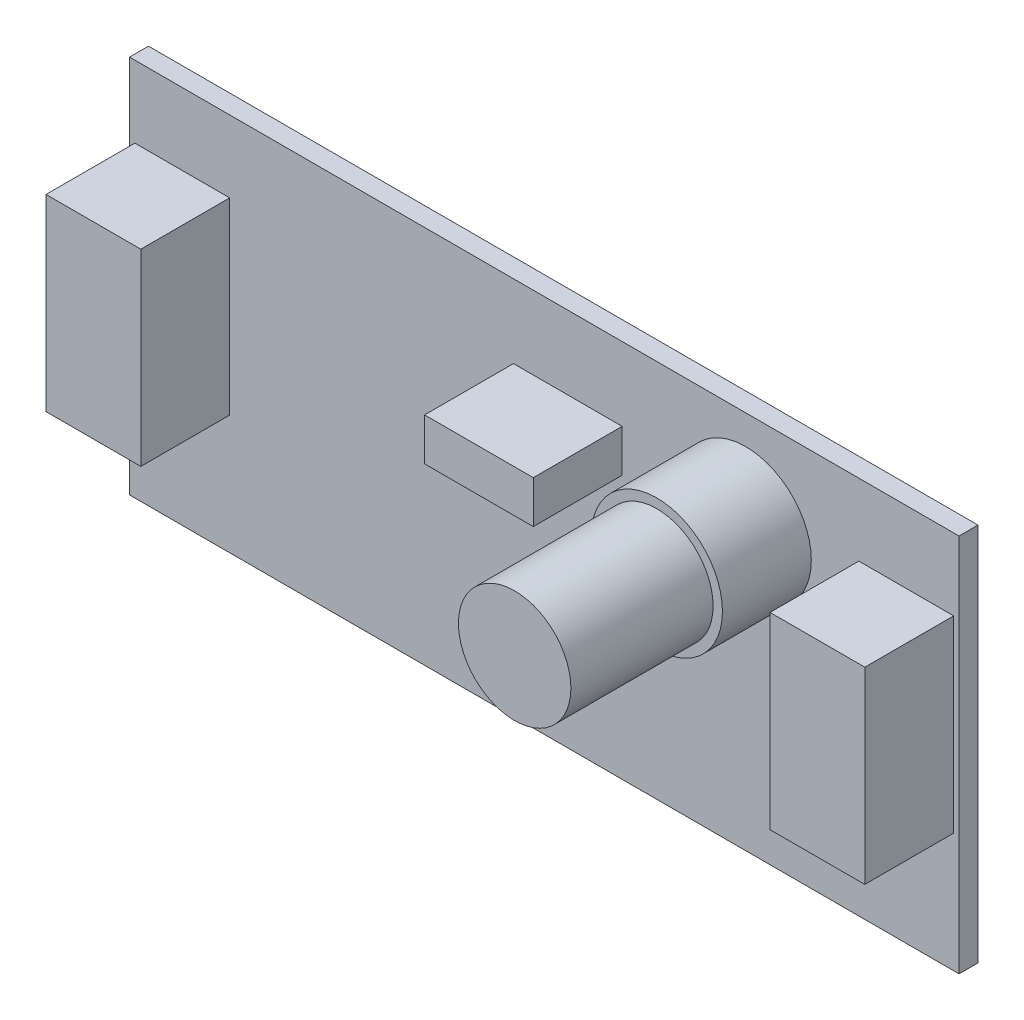
ISO-10303-21;
HEADER;
FILE_DESCRIPTION(('STEP AP214'),'2;1');
FILE_NAME('part.step','',(''),(''),'','','');
FILE_SCHEMA(('AUTOMOTIVE_DESIGN { 1 0 10303 214 1 1 1 1 }'));
ENDSEC;
DATA;
#1=APPLICATION_CONTEXT('core data for automotive mechanical design processes');
#2=APPLICATION_PROTOCOL_DEFINITION('international standard','automotive_design',2000,#1);
#3=PRODUCT_CONTEXT('',#1,'mechanical');
#4=PRODUCT('Part','Part','',(#3));
#5=PRODUCT_RELATED_PRODUCT_CATEGORY('part','',(#4));
#6=PRODUCT_DEFINITION_FORMATION('','',#4);
#7=PRODUCT_DEFINITION_CONTEXT('part definition',#1,'design');
#8=PRODUCT_DEFINITION('design','',#6,#7);
#9=PRODUCT_DEFINITION_SHAPE('','',#8);
#10=(LENGTH_UNIT() NAMED_UNIT(*) SI_UNIT(.MILLI.,.METRE.));
#11=(NAMED_UNIT(*) PLANE_ANGLE_UNIT() SI_UNIT($,.RADIAN.));
#12=(NAMED_UNIT(*) SI_UNIT($,.STERADIAN.) SOLID_ANGLE_UNIT());
#13=UNCERTAINTY_MEASURE_WITH_UNIT(LENGTH_MEASURE(1.E-05),#10,'distance_accuracy_value','');
#14=(GEOMETRIC_REPRESENTATION_CONTEXT(3) GLOBAL_UNCERTAINTY_ASSIGNED_CONTEXT((#13)) GLOBAL_UNIT_ASSIGNED_CONTEXT((#10,
#11,#12)) REPRESENTATION_CONTEXT('',''));
#15=CARTESIAN_POINT('',(0.,0.,0.));
#16=DIRECTION('',(0.,0.,1.));
#17=DIRECTION('',(1.,0.,0.));
#18=AXIS2_PLACEMENT_3D('',#15,#16,#17);
#19=CARTESIAN_POINT('',(0.,0.,0.));
#20=DIRECTION('',(0.,0.,1.));
#21=DIRECTION('',(1.,0.,0.));
#22=AXIS2_PLACEMENT_3D('',#19,#20,#21);
#23=PLANE('',#22);
#24=CARTESIAN_POINT('',(51.999892991311,23.9999621550569,0.));
#25=DIRECTION('',(0.,0.,1.));
#26=DIRECTION('',(1.,0.,0.));
#27=AXIS2_PLACEMENT_3D('',#24,#25,#26);
#28=CIRCLE('',#27,5.53323012461018);
#29=CARTESIAN_POINT('',(57.5331231159212,23.9999621550569,0.));
#30=VERTEX_POINT('',#29);
#31=EDGE_CURVE('E268',#30,#30,#28,.T.);
#32=ORIENTED_EDGE('',*,*,#31,.F.);
#33=EDGE_LOOP('',(#32));
#34=FACE_BOUND('',#33,.T.);
#35=DIRECTION('',(0.,-1.,0.));
#36=VECTOR('',#35,1.);
#37=CARTESIAN_POINT('',(0.,31.999936,0.));
#38=LINE('',#37,#36);
#39=CARTESIAN_POINT('',(0.,31.999936,0.));
#40=VERTEX_POINT('',#39);
#41=CARTESIAN_POINT('',(0.,0.,0.));
#42=VERTEX_POINT('',#41);
#43=EDGE_CURVE('E284',#40,#42,#38,.T.);
#44=ORIENTED_EDGE('',*,*,#43,.T.);
#45=DIRECTION('',(1.,0.,0.));
#46=VECTOR('',#45,1.);
#47=CARTESIAN_POINT('',(0.,0.,0.));
#48=LINE('',#47,#46);
#49=CARTESIAN_POINT('',(69.99986,0.,0.));
#50=VERTEX_POINT('',#49);
#51=EDGE_CURVE('E308',#42,#50,#48,.T.);
#52=ORIENTED_EDGE('',*,*,#51,.T.);
#53=DIRECTION('',(0.,1.,0.));
#54=VECTOR('',#53,1.);
#55=CARTESIAN_POINT('',(69.99986,31.999936,0.));
#56=LINE('',#55,#54);
#57=CARTESIAN_POINT('',(69.99986,31.999936,0.));
#58=VERTEX_POINT('',#57);
#59=EDGE_CURVE('E312',#50,#58,#56,.T.);
#60=ORIENTED_EDGE('',*,*,#59,.T.);
#61=DIRECTION('',(-1.,0.,0.));
#62=VECTOR('',#61,1.);
#63=CARTESIAN_POINT('',(0.,31.999936,0.));
#64=LINE('',#63,#62);
#65=EDGE_CURVE('E293',#58,#40,#64,.T.);
#66=ORIENTED_EDGE('',*,*,#65,.T.);
#67=EDGE_LOOP('',(#44,#52,#60,#66));
#68=FACE_BOUND('',#67,.T.);
#69=DIRECTION('',(-1.,0.,0.));
#70=VECTOR('',#69,1.);
#71=CARTESIAN_POINT('',(69.5478416000002,25.9379466000001,0.));
#72=LINE('',#71,#70);
#73=CARTESIAN_POINT('',(69.5478416000002,25.9379466000001,0.));
#74=VERTEX_POINT('',#73);
#75=CARTESIAN_POINT('',(61.5468669999999,25.9379466000001,0.));
#76=VERTEX_POINT('',#75);
#77=EDGE_CURVE('E261',#74,#76,#72,.T.);
#78=ORIENTED_EDGE('',*,*,#77,.F.);
#79=DIRECTION('',(0.,1.,0.));
#80=VECTOR('',#79,1.);
#81=CARTESIAN_POINT('',(69.5478416000002,25.9379466000001,0.));
#82=LINE('',#81,#80);
#83=CARTESIAN_POINT('',(69.5478416000002,10.0619813999999,0.));
#84=VERTEX_POINT('',#83);
#85=EDGE_CURVE('E264',#84,#74,#82,.T.);
#86=ORIENTED_EDGE('',*,*,#85,.F.);
#87=DIRECTION('',(1.,0.,0.));
#88=VECTOR('',#87,1.);
#89=CARTESIAN_POINT('',(69.5478416000002,10.0619813999999,0.));
#90=LINE('',#89,#88);
#91=CARTESIAN_POINT('',(61.5468669999999,10.0619813999999,0.));
#92=VERTEX_POINT('',#91);
#93=EDGE_CURVE('E253',#92,#84,#90,.T.);
#94=ORIENTED_EDGE('',*,*,#93,.F.);
#95=DIRECTION('',(0.,-1.,0.));
#96=VECTOR('',#95,1.);
#97=CARTESIAN_POINT('',(61.5468669999999,25.9379466000001,0.));
#98=LINE('',#97,#96);
#99=EDGE_CURVE('E256',#76,#92,#98,.T.);
#100=ORIENTED_EDGE('',*,*,#99,.F.);
#101=EDGE_LOOP('',(#78,#86,#94,#100));
#102=FACE_BOUND('',#101,.T.);
#103=DIRECTION('',(1.,0.,0.));
#104=VECTOR('',#103,1.);
#105=CARTESIAN_POINT('',(0.452018400000055,10.0619813999999,0.));
#106=LINE('',#105,#104);
#107=CARTESIAN_POINT('',(0.452018400000055,10.0619813999999,0.));
#108=VERTEX_POINT('',#107);
#109=CARTESIAN_POINT('',(8.45299299999996,10.0619813999999,0.));
#110=VERTEX_POINT('',#109);
#111=EDGE_CURVE('E220',#108,#110,#106,.T.);
#112=ORIENTED_EDGE('',*,*,#111,.F.);
#113=DIRECTION('',(0.,-1.,0.));
#114=VECTOR('',#113,1.);
#115=CARTESIAN_POINT('',(0.452018400000053,25.9379466000001,0.));
#116=LINE('',#115,#114);
#117=CARTESIAN_POINT('',(0.452018400000053,25.9379466000001,0.));
#118=VERTEX_POINT('',#117);
#119=EDGE_CURVE('E223',#118,#108,#116,.T.);
#120=ORIENTED_EDGE('',*,*,#119,.F.);
#121=DIRECTION('',(-1.,0.,0.));
#122=VECTOR('',#121,1.);
#123=CARTESIAN_POINT('',(0.452018400000053,25.9379466000001,0.));
#124=LINE('',#123,#122);
#125=CARTESIAN_POINT('',(8.45299299999995,25.9379466000001,0.));
#126=VERTEX_POINT('',#125);
#127=EDGE_CURVE('E213',#126,#118,#124,.T.);
#128=ORIENTED_EDGE('',*,*,#127,.F.);
#129=DIRECTION('',(0.,1.,0.));
#130=VECTOR('',#129,1.);
#131=CARTESIAN_POINT('',(8.45299299999995,25.9379466000001,0.));
#132=LINE('',#131,#130);
#133=EDGE_CURVE('E216',#110,#126,#132,.T.);
#134=ORIENTED_EDGE('',*,*,#133,.F.);
#135=EDGE_LOOP('',(#112,#120,#128,#134));
#136=FACE_BOUND('',#135,.T.);
#137=DIRECTION('',(1.,0.,0.));
#138=VECTOR('',#137,1.);
#139=CARTESIAN_POINT('',(32.3999606,22.222079,0.));
#140=LINE('',#139,#138);
#141=CARTESIAN_POINT('',(32.3999606,22.222079,0.));
#142=VERTEX_POINT('',#141);
#143=CARTESIAN_POINT('',(41.5719260000001,22.222079,0.));
#144=VERTEX_POINT('',#143);
#145=EDGE_CURVE('E182',#142,#144,#140,.T.);
#146=ORIENTED_EDGE('',*,*,#145,.F.);
#147=DIRECTION('',(0.,-1.,0.));
#148=VECTOR('',#147,1.);
#149=CARTESIAN_POINT('',(32.3999606,25.8001008,0.));
#150=LINE('',#149,#148);
#151=CARTESIAN_POINT('',(32.3999606,25.8001008,0.));
#152=VERTEX_POINT('',#151);
#153=EDGE_CURVE('E176',#152,#142,#150,.T.);
#154=ORIENTED_EDGE('',*,*,#153,.F.);
#155=DIRECTION('',(-1.,0.,0.));
#156=VECTOR('',#155,1.);
#157=CARTESIAN_POINT('',(32.3999606,25.8001008,0.));
#158=LINE('',#157,#156);
#159=CARTESIAN_POINT('',(41.5719260000001,25.8001008,0.));
#160=VERTEX_POINT('',#159);
#161=EDGE_CURVE('E160',#160,#152,#158,.T.);
#162=ORIENTED_EDGE('',*,*,#161,.F.);
#163=DIRECTION('',(0.,1.,0.));
#164=VECTOR('',#163,1.);
#165=CARTESIAN_POINT('',(41.5719260000001,25.8001008,0.));
#166=LINE('',#165,#164);
#167=EDGE_CURVE('E169',#144,#160,#166,.T.);
#168=ORIENTED_EDGE('',*,*,#167,.F.);
#169=EDGE_LOOP('',(#146,#154,#162,#168));
#170=FACE_BOUND('',#169,.T.);
#171=ADVANCED_FACE('F43',(#34,#68,#102,#136,#170),#23,.T.);
#172=CARTESIAN_POINT('',(0.,31.999936,-1.6));
#173=DIRECTION('',(-1.,0.,0.));
#174=DIRECTION('',(0.,0.,1.));
#175=AXIS2_PLACEMENT_3D('',#172,#173,#174);
#176=PLANE('',#175);
#177=ORIENTED_EDGE('',*,*,#43,.F.);
#178=DIRECTION('',(0.,0.,1.));
#179=VECTOR('',#178,1.);
#180=CARTESIAN_POINT('',(0.,31.999936,-1.6));
#181=LINE('',#180,#179);
#182=CARTESIAN_POINT('',(0.,31.999936,-1.6));
#183=VERTEX_POINT('',#182);
#184=EDGE_CURVE('E53',#183,#40,#181,.T.);
#185=ORIENTED_EDGE('',*,*,#184,.F.);
#186=DIRECTION('',(0.,-1.,0.));
#187=VECTOR('',#186,1.);
#188=CARTESIAN_POINT('',(0.,31.999936,-1.6));
#189=LINE('',#188,#187);
#190=CARTESIAN_POINT('',(0.,0.,-1.6));
#191=VERTEX_POINT('',#190);
#192=EDGE_CURVE('E288',#183,#191,#189,.T.);
#193=ORIENTED_EDGE('',*,*,#192,.T.);
#194=DIRECTION('',(0.,0.,1.));
#195=VECTOR('',#194,1.);
#196=CARTESIAN_POINT('',(0.,0.,-1.6));
#197=LINE('',#196,#195);
#198=EDGE_CURVE('E47',#191,#42,#197,.T.);
#199=ORIENTED_EDGE('',*,*,#198,.T.);
#200=EDGE_LOOP('',(#177,#185,#193,#199));
#201=FACE_BOUND('',#200,.T.);
#202=ADVANCED_FACE('F45',(#201),#176,.T.);
#203=CARTESIAN_POINT('',(0.,31.999936,-1.6));
#204=DIRECTION('',(0.,1.,0.));
#205=DIRECTION('',(0.,0.,1.));
#206=AXIS2_PLACEMENT_3D('',#203,#204,#205);
#207=PLANE('',#206);
#208=ORIENTED_EDGE('',*,*,#65,.F.);
#209=DIRECTION('',(0.,0.,1.));
#210=VECTOR('',#209,1.);
#211=CARTESIAN_POINT('',(69.99986,31.999936,-1.6));
#212=LINE('',#211,#210);
#213=CARTESIAN_POINT('',(69.99986,31.999936,-1.6));
#214=VERTEX_POINT('',#213);
#215=EDGE_CURVE('E321',#214,#58,#212,.T.);
#216=ORIENTED_EDGE('',*,*,#215,.F.);
#217=DIRECTION('',(-1.,0.,0.));
#218=VECTOR('',#217,1.);
#219=CARTESIAN_POINT('',(0.,31.999936,-1.6));
#220=LINE('',#219,#218);
#221=EDGE_CURVE('E301',#214,#183,#220,.T.);
#222=ORIENTED_EDGE('',*,*,#221,.T.);
#223=ORIENTED_EDGE('',*,*,#184,.T.);
#224=EDGE_LOOP('',(#208,#216,#222,#223));
#225=FACE_BOUND('',#224,.T.);
#226=ADVANCED_FACE('F338',(#225),#207,.T.);
#227=CARTESIAN_POINT('',(69.99986,31.999936,-1.6));
#228=DIRECTION('',(1.,0.,0.));
#229=DIRECTION('',(0.,0.,-1.));
#230=AXIS2_PLACEMENT_3D('',#227,#228,#229);
#231=PLANE('',#230);
#232=ORIENTED_EDGE('',*,*,#59,.F.);
#233=DIRECTION('',(0.,0.,1.));
#234=VECTOR('',#233,1.);
#235=CARTESIAN_POINT('',(69.99986,0.,-1.6));
#236=LINE('',#235,#234);
#237=CARTESIAN_POINT('',(69.99986,0.,-1.6));
#238=VERTEX_POINT('',#237);
#239=EDGE_CURVE('E323',#238,#50,#236,.T.);
#240=ORIENTED_EDGE('',*,*,#239,.F.);
#241=DIRECTION('',(0.,1.,0.));
#242=VECTOR('',#241,1.);
#243=CARTESIAN_POINT('',(69.99986,31.999936,-1.6));
#244=LINE('',#243,#242);
#245=EDGE_CURVE('E297',#238,#214,#244,.T.);
#246=ORIENTED_EDGE('',*,*,#245,.T.);
#247=ORIENTED_EDGE('',*,*,#215,.T.);
#248=EDGE_LOOP('',(#232,#240,#246,#247));
#249=FACE_BOUND('',#248,.T.);
#250=ADVANCED_FACE('F344',(#249),#231,.T.);
#251=CARTESIAN_POINT('',(0.,0.,-1.6));
#252=DIRECTION('',(0.,-1.,0.));
#253=DIRECTION('',(0.,0.,-1.));
#254=AXIS2_PLACEMENT_3D('',#251,#252,#253);
#255=PLANE('',#254);
#256=ORIENTED_EDGE('',*,*,#51,.F.);
#257=ORIENTED_EDGE('',*,*,#198,.F.);
#258=DIRECTION('',(1.,0.,0.));
#259=VECTOR('',#258,1.);
#260=CARTESIAN_POINT('',(0.,0.,-1.6));
#261=LINE('',#260,#259);
#262=EDGE_CURVE('E292',#191,#238,#261,.T.);
#263=ORIENTED_EDGE('',*,*,#262,.T.);
#264=ORIENTED_EDGE('',*,*,#239,.T.);
#265=EDGE_LOOP('',(#256,#257,#263,#264));
#266=FACE_BOUND('',#265,.T.);
#267=ADVANCED_FACE('F333',(#266),#255,.T.);
#268=CARTESIAN_POINT('',(0.,0.,-1.6));
#269=DIRECTION('',(0.,0.,1.));
#270=DIRECTION('',(1.,0.,0.));
#271=AXIS2_PLACEMENT_3D('',#268,#269,#270);
#272=PLANE('',#271);
#273=ORIENTED_EDGE('',*,*,#192,.F.);
#274=ORIENTED_EDGE('',*,*,#221,.F.);
#275=ORIENTED_EDGE('',*,*,#245,.F.);
#276=ORIENTED_EDGE('',*,*,#262,.F.);
#277=EDGE_LOOP('',(#273,#274,#275,#276));
#278=FACE_BOUND('',#277,.T.);
#279=ADVANCED_FACE('F341',(#278),#272,.F.);
#280=CARTESIAN_POINT('',(51.999892991311,23.9999621550569,7.5));
#281=DIRECTION('',(0.,0.,-1.));
#282=DIRECTION('',(-1.,0.,0.));
#283=AXIS2_PLACEMENT_3D('',#280,#281,#282);
#284=CYLINDRICAL_SURFACE('',#283,5.53323012461018);
#285=CARTESIAN_POINT('',(51.999892991311,23.9999621550569,7.5));
#286=DIRECTION('',(0.,0.,1.));
#287=DIRECTION('',(1.,0.,0.));
#288=AXIS2_PLACEMENT_3D('',#285,#286,#287);
#289=CIRCLE('',#288,5.53323012461018);
#290=CARTESIAN_POINT('',(57.5331231159212,23.9999621550569,7.5));
#291=VERTEX_POINT('',#290);
#292=EDGE_CURVE('E280',#291,#291,#289,.T.);
#293=ORIENTED_EDGE('',*,*,#292,.F.);
#294=EDGE_LOOP('',(#293));
#295=FACE_BOUND('',#294,.T.);
#296=ORIENTED_EDGE('',*,*,#31,.T.);
#297=EDGE_LOOP('',(#296));
#298=FACE_BOUND('',#297,.T.);
#299=ADVANCED_FACE('F362',(#295,#298),#284,.T.);
#300=CARTESIAN_POINT('',(51.999892991311,23.9999621550569,7.5));
#301=DIRECTION('',(0.,0.,1.));
#302=DIRECTION('',(1.,0.,0.));
#303=AXIS2_PLACEMENT_3D('',#300,#301,#302);
#304=PLANE('',#303);
#305=CARTESIAN_POINT('',(51.999892991311,23.9999621550569,7.5));
#306=DIRECTION('',(0.,0.,1.));
#307=DIRECTION('',(1.,0.,0.));
#308=AXIS2_PLACEMENT_3D('',#305,#306,#307);
#309=CIRCLE('',#308,4.74501585625525);
#310=CARTESIAN_POINT('',(56.7449088475663,23.9999621550569,7.5));
#311=VERTEX_POINT('',#310);
#312=EDGE_CURVE('E11',#311,#311,#309,.T.);
#313=ORIENTED_EDGE('',*,*,#312,.F.);
#314=EDGE_LOOP('',(#313));
#315=FACE_BOUND('',#314,.T.);
#316=ORIENTED_EDGE('',*,*,#292,.T.);
#317=EDGE_LOOP('',(#316));
#318=FACE_BOUND('',#317,.T.);
#319=ADVANCED_FACE('F365',(#315,#318),#304,.T.);
#320=CARTESIAN_POINT('',(69.5478416000002,25.9379466000001,7.5));
#321=DIRECTION('',(-1.,0.,0.));
#322=DIRECTION('',(0.,0.,1.));
#323=AXIS2_PLACEMENT_3D('',#320,#321,#322);
#324=PLANE('',#323);
#325=ORIENTED_EDGE('',*,*,#85,.T.);
#326=DIRECTION('',(0.,0.,-1.));
#327=VECTOR('',#326,1.);
#328=CARTESIAN_POINT('',(69.5478416000002,25.9379466000001,7.5));
#329=LINE('',#328,#327);
#330=CARTESIAN_POINT('',(69.5478416000002,25.9379466000001,7.5));
#331=VERTEX_POINT('',#330);
#332=EDGE_CURVE('E227',#331,#74,#329,.T.);
#333=ORIENTED_EDGE('',*,*,#332,.F.);
#334=DIRECTION('',(0.,1.,0.));
#335=VECTOR('',#334,1.);
#336=CARTESIAN_POINT('',(69.5478416000002,25.9379466000001,7.5));
#337=LINE('',#336,#335);
#338=CARTESIAN_POINT('',(69.5478416000002,10.0619813999999,7.5));
#339=VERTEX_POINT('',#338);
#340=EDGE_CURVE('E257',#339,#331,#337,.T.);
#341=ORIENTED_EDGE('',*,*,#340,.F.);
#342=DIRECTION('',(0.,0.,-1.));
#343=VECTOR('',#342,1.);
#344=CARTESIAN_POINT('',(69.5478416000002,10.0619813999999,7.5));
#345=LINE('',#344,#343);
#346=EDGE_CURVE('E248',#339,#84,#345,.T.);
#347=ORIENTED_EDGE('',*,*,#346,.T.);
#348=EDGE_LOOP('',(#325,#333,#341,#347));
#349=FACE_BOUND('',#348,.T.);
#350=ADVANCED_FACE('F369',(#349),#324,.F.);
#351=CARTESIAN_POINT('',(69.5478416000002,25.9379466000001,7.5));
#352=DIRECTION('',(0.,-1.,0.));
#353=DIRECTION('',(0.,0.,-1.));
#354=AXIS2_PLACEMENT_3D('',#351,#352,#353);
#355=PLANE('',#354);
#356=ORIENTED_EDGE('',*,*,#77,.T.);
#357=DIRECTION('',(0.,0.,-1.));
#358=VECTOR('',#357,1.);
#359=CARTESIAN_POINT('',(61.5468669999999,25.9379466000001,7.5));
#360=LINE('',#359,#358);
#361=CARTESIAN_POINT('',(61.5468669999999,25.9379466000001,7.5));
#362=VERTEX_POINT('',#361);
#363=EDGE_CURVE('E241',#362,#76,#360,.T.);
#364=ORIENTED_EDGE('',*,*,#363,.F.);
#365=DIRECTION('',(-1.,0.,0.));
#366=VECTOR('',#365,1.);
#367=CARTESIAN_POINT('',(69.5478416000002,25.9379466000001,7.5));
#368=LINE('',#367,#366);
#369=EDGE_CURVE('E274',#331,#362,#368,.T.);
#370=ORIENTED_EDGE('',*,*,#369,.F.);
#371=ORIENTED_EDGE('',*,*,#332,.T.);
#372=EDGE_LOOP('',(#356,#364,#370,#371));
#373=FACE_BOUND('',#372,.T.);
#374=ADVANCED_FACE('F383',(#373),#355,.F.);
#375=CARTESIAN_POINT('',(61.5468669999999,25.9379466000001,7.5));
#376=DIRECTION('',(1.,0.,0.));
#377=DIRECTION('',(0.,0.,-1.));
#378=AXIS2_PLACEMENT_3D('',#375,#376,#377);
#379=PLANE('',#378);
#380=ORIENTED_EDGE('',*,*,#99,.T.);
#381=DIRECTION('',(0.,0.,-1.));
#382=VECTOR('',#381,1.);
#383=CARTESIAN_POINT('',(61.5468669999999,10.0619813999999,7.5));
#384=LINE('',#383,#382);
#385=CARTESIAN_POINT('',(61.5468669999999,10.0619813999999,7.5));
#386=VERTEX_POINT('',#385);
#387=EDGE_CURVE('E245',#386,#92,#384,.T.);
#388=ORIENTED_EDGE('',*,*,#387,.F.);
#389=DIRECTION('',(0.,-1.,0.));
#390=VECTOR('',#389,1.);
#391=CARTESIAN_POINT('',(61.5468669999999,25.9379466000001,7.5));
#392=LINE('',#391,#390);
#393=EDGE_CURVE('E271',#362,#386,#392,.T.);
#394=ORIENTED_EDGE('',*,*,#393,.F.);
#395=ORIENTED_EDGE('',*,*,#363,.T.);
#396=EDGE_LOOP('',(#380,#388,#394,#395));
#397=FACE_BOUND('',#396,.T.);
#398=ADVANCED_FACE('F379',(#397),#379,.F.);
#399=CARTESIAN_POINT('',(69.5478416000002,10.0619813999999,7.5));
#400=DIRECTION('',(0.,1.,0.));
#401=DIRECTION('',(0.,0.,1.));
#402=AXIS2_PLACEMENT_3D('',#399,#400,#401);
#403=PLANE('',#402);
#404=ORIENTED_EDGE('',*,*,#93,.T.);
#405=ORIENTED_EDGE('',*,*,#346,.F.);
#406=DIRECTION('',(1.,0.,0.));
#407=VECTOR('',#406,1.);
#408=CARTESIAN_POINT('',(69.5478416000002,10.0619813999999,7.5));
#409=LINE('',#408,#407);
#410=EDGE_CURVE('E252',#386,#339,#409,.T.);
#411=ORIENTED_EDGE('',*,*,#410,.F.);
#412=ORIENTED_EDGE('',*,*,#387,.T.);
#413=EDGE_LOOP('',(#404,#405,#411,#412));
#414=FACE_BOUND('',#413,.T.);
#415=ADVANCED_FACE('F375',(#414),#403,.F.);
#416=CARTESIAN_POINT('',(0.,0.,7.5));
#417=DIRECTION('',(0.,0.,-1.));
#418=DIRECTION('',(-1.,0.,0.));
#419=AXIS2_PLACEMENT_3D('',#416,#417,#418);
#420=PLANE('',#419);
#421=ORIENTED_EDGE('',*,*,#340,.T.);
#422=ORIENTED_EDGE('',*,*,#369,.T.);
#423=ORIENTED_EDGE('',*,*,#393,.T.);
#424=ORIENTED_EDGE('',*,*,#410,.T.);
#425=EDGE_LOOP('',(#421,#422,#423,#424));
#426=FACE_BOUND('',#425,.T.);
#427=ADVANCED_FACE('F371',(#426),#420,.F.);
#428=CARTESIAN_POINT('',(0.452018400000053,25.9379466000001,7.5));
#429=DIRECTION('',(1.,0.,0.));
#430=DIRECTION('',(0.,1.,0.));
#431=AXIS2_PLACEMENT_3D('',#428,#429,#430);
#432=PLANE('',#431);
#433=ORIENTED_EDGE('',*,*,#119,.T.);
#434=DIRECTION('',(0.,0.,-1.));
#435=VECTOR('',#434,1.);
#436=CARTESIAN_POINT('',(0.452018400000055,10.0619813999999,7.5));
#437=LINE('',#436,#435);
#438=CARTESIAN_POINT('',(0.452018400000055,10.0619813999999,7.5));
#439=VERTEX_POINT('',#438);
#440=EDGE_CURVE('E184',#439,#108,#437,.T.);
#441=ORIENTED_EDGE('',*,*,#440,.F.);
#442=DIRECTION('',(0.,-1.,0.));
#443=VECTOR('',#442,1.);
#444=CARTESIAN_POINT('',(0.452018400000053,25.9379466000001,7.5));
#445=LINE('',#444,#443);
#446=CARTESIAN_POINT('',(0.452018400000053,25.9379466000001,7.5));
#447=VERTEX_POINT('',#446);
#448=EDGE_CURVE('E217',#447,#439,#445,.T.);
#449=ORIENTED_EDGE('',*,*,#448,.F.);
#450=DIRECTION('',(0.,0.,-1.));
#451=VECTOR('',#450,1.);
#452=CARTESIAN_POINT('',(0.452018400000053,25.9379466000001,7.5));
#453=LINE('',#452,#451);
#454=EDGE_CURVE('E208',#447,#118,#453,.T.);
#455=ORIENTED_EDGE('',*,*,#454,.T.);
#456=EDGE_LOOP('',(#433,#441,#449,#455));
#457=FACE_BOUND('',#456,.T.);
#458=ADVANCED_FACE('F374',(#457),#432,.F.);
#459=CARTESIAN_POINT('',(0.452018400000055,10.0619813999999,7.5));
#460=DIRECTION('',(0.,1.,0.));
#461=DIRECTION('',(0.,0.,1.));
#462=AXIS2_PLACEMENT_3D('',#459,#460,#461);
#463=PLANE('',#462);
#464=ORIENTED_EDGE('',*,*,#111,.T.);
#465=DIRECTION('',(0.,0.,-1.));
#466=VECTOR('',#465,1.);
#467=CARTESIAN_POINT('',(8.45299299999996,10.0619813999999,7.5));
#468=LINE('',#467,#466);
#469=CARTESIAN_POINT('',(8.45299299999996,10.0619813999999,7.5));
#470=VERTEX_POINT('',#469);
#471=EDGE_CURVE('E188',#470,#110,#468,.T.);
#472=ORIENTED_EDGE('',*,*,#471,.F.);
#473=DIRECTION('',(1.,0.,0.));
#474=VECTOR('',#473,1.);
#475=CARTESIAN_POINT('',(0.452018400000055,10.0619813999999,7.5));
#476=LINE('',#475,#474);
#477=EDGE_CURVE('E233',#439,#470,#476,.T.);
#478=ORIENTED_EDGE('',*,*,#477,.F.);
#479=ORIENTED_EDGE('',*,*,#440,.T.);
#480=EDGE_LOOP('',(#464,#472,#478,#479));
#481=FACE_BOUND('',#480,.T.);
#482=ADVANCED_FACE('F401',(#481),#463,.F.);
#483=CARTESIAN_POINT('',(8.45299299999995,25.9379466000001,7.5));
#484=DIRECTION('',(-1.,0.,0.));
#485=DIRECTION('',(0.,-1.,0.));
#486=AXIS2_PLACEMENT_3D('',#483,#484,#485);
#487=PLANE('',#486);
#488=ORIENTED_EDGE('',*,*,#133,.T.);
#489=DIRECTION('',(0.,0.,-1.));
#490=VECTOR('',#489,1.);
#491=CARTESIAN_POINT('',(8.45299299999995,25.9379466000001,7.5));
#492=LINE('',#491,#490);
#493=CARTESIAN_POINT('',(8.45299299999995,25.9379466000001,7.5));
#494=VERTEX_POINT('',#493);
#495=EDGE_CURVE('E69',#494,#126,#492,.T.);
#496=ORIENTED_EDGE('',*,*,#495,.F.);
#497=DIRECTION('',(0.,1.,0.));
#498=VECTOR('',#497,1.);
#499=CARTESIAN_POINT('',(8.45299299999995,25.9379466000001,7.5));
#500=LINE('',#499,#498);
#501=EDGE_CURVE('E230',#470,#494,#500,.T.);
#502=ORIENTED_EDGE('',*,*,#501,.F.);
#503=ORIENTED_EDGE('',*,*,#471,.T.);
#504=EDGE_LOOP('',(#488,#496,#502,#503));
#505=FACE_BOUND('',#504,.T.);
#506=ADVANCED_FACE('F398',(#505),#487,.F.);
#507=CARTESIAN_POINT('',(0.452018400000053,25.9379466000001,7.5));
#508=DIRECTION('',(0.,-1.,0.));
#509=DIRECTION('',(0.,0.,-1.));
#510=AXIS2_PLACEMENT_3D('',#507,#508,#509);
#511=PLANE('',#510);
#512=ORIENTED_EDGE('',*,*,#127,.T.);
#513=ORIENTED_EDGE('',*,*,#454,.F.);
#514=DIRECTION('',(-1.,0.,0.));
#515=VECTOR('',#514,1.);
#516=CARTESIAN_POINT('',(0.452018400000053,25.9379466000001,7.5));
#517=LINE('',#516,#515);
#518=EDGE_CURVE('E212',#494,#447,#517,.T.);
#519=ORIENTED_EDGE('',*,*,#518,.F.);
#520=ORIENTED_EDGE('',*,*,#495,.T.);
#521=EDGE_LOOP('',(#512,#513,#519,#520));
#522=FACE_BOUND('',#521,.T.);
#523=ADVANCED_FACE('F394',(#522),#511,.F.);
#524=CARTESIAN_POINT('',(0.,0.,7.5));
#525=DIRECTION('',(0.,0.,1.));
#526=DIRECTION('',(1.,0.,0.));
#527=AXIS2_PLACEMENT_3D('',#524,#525,#526);
#528=PLANE('',#527);
#529=ORIENTED_EDGE('',*,*,#448,.T.);
#530=ORIENTED_EDGE('',*,*,#477,.T.);
#531=ORIENTED_EDGE('',*,*,#501,.T.);
#532=ORIENTED_EDGE('',*,*,#518,.T.);
#533=EDGE_LOOP('',(#529,#530,#531,#532));
#534=FACE_BOUND('',#533,.T.);
#535=ADVANCED_FACE('F391',(#534),#528,.T.);
#536=CARTESIAN_POINT('',(32.3999606,25.8001008,7.5));
#537=DIRECTION('',(1.,0.,0.));
#538=DIRECTION('',(0.,0.,-1.));
#539=AXIS2_PLACEMENT_3D('',#536,#537,#538);
#540=PLANE('',#539);
#541=ORIENTED_EDGE('',*,*,#153,.T.);
#542=DIRECTION('',(0.,0.,-1.));
#543=VECTOR('',#542,1.);
#544=CARTESIAN_POINT('',(32.3999606,22.222079,7.5));
#545=LINE('',#544,#543);
#546=CARTESIAN_POINT('',(32.3999606,22.222079,7.5));
#547=VERTEX_POINT('',#546);
#548=EDGE_CURVE('E438',#547,#142,#545,.T.);
#549=ORIENTED_EDGE('',*,*,#548,.F.);
#550=DIRECTION('',(0.,-1.,0.));
#551=VECTOR('',#550,1.);
#552=CARTESIAN_POINT('',(32.3999606,25.8001008,7.5));
#553=LINE('',#552,#551);
#554=CARTESIAN_POINT('',(32.3999606,25.8001008,7.5));
#555=VERTEX_POINT('',#554);
#556=EDGE_CURVE('E170',#555,#547,#553,.T.);
#557=ORIENTED_EDGE('',*,*,#556,.F.);
#558=DIRECTION('',(0.,0.,-1.));
#559=VECTOR('',#558,1.);
#560=CARTESIAN_POINT('',(32.3999606,25.8001008,7.5));
#561=LINE('',#560,#559);
#562=EDGE_CURVE('E163',#555,#152,#561,.T.);
#563=ORIENTED_EDGE('',*,*,#562,.T.);
#564=EDGE_LOOP('',(#541,#549,#557,#563));
#565=FACE_BOUND('',#564,.T.);
#566=ADVANCED_FACE('F174',(#565),#540,.F.);
#567=CARTESIAN_POINT('',(32.3999606,22.222079,7.5));
#568=DIRECTION('',(0.,1.,0.));
#569=DIRECTION('',(0.,0.,1.));
#570=AXIS2_PLACEMENT_3D('',#567,#568,#569);
#571=PLANE('',#570);
#572=ORIENTED_EDGE('',*,*,#145,.T.);
#573=DIRECTION('',(0.,0.,-1.));
#574=VECTOR('',#573,1.);
#575=CARTESIAN_POINT('',(41.5719260000001,22.222079,7.5));
#576=LINE('',#575,#574);
#577=CARTESIAN_POINT('',(41.5719260000001,22.222079,7.5));
#578=VERTEX_POINT('',#577);
#579=EDGE_CURVE('E441',#578,#144,#576,.T.);
#580=ORIENTED_EDGE('',*,*,#579,.F.);
#581=DIRECTION('',(1.,0.,0.));
#582=VECTOR('',#581,1.);
#583=CARTESIAN_POINT('',(32.3999606,22.222079,7.5));
#584=LINE('',#583,#582);
#585=EDGE_CURVE('E198',#547,#578,#584,.T.);
#586=ORIENTED_EDGE('',*,*,#585,.F.);
#587=ORIENTED_EDGE('',*,*,#548,.T.);
#588=EDGE_LOOP('',(#572,#580,#586,#587));
#589=FACE_BOUND('',#588,.T.);
#590=ADVANCED_FACE('F419',(#589),#571,.F.);
#591=CARTESIAN_POINT('',(41.5719260000001,25.8001008,7.5));
#592=DIRECTION('',(-1.,0.,0.));
#593=DIRECTION('',(0.,0.,1.));
#594=AXIS2_PLACEMENT_3D('',#591,#592,#593);
#595=PLANE('',#594);
#596=ORIENTED_EDGE('',*,*,#167,.T.);
#597=DIRECTION('',(0.,0.,-1.));
#598=VECTOR('',#597,1.);
#599=CARTESIAN_POINT('',(41.5719260000001,25.8001008,7.5));
#600=LINE('',#599,#598);
#601=CARTESIAN_POINT('',(41.5719260000001,25.8001008,7.5));
#602=VERTEX_POINT('',#601);
#603=EDGE_CURVE('E61',#602,#160,#600,.T.);
#604=ORIENTED_EDGE('',*,*,#603,.F.);
#605=DIRECTION('',(0.,1.,0.));
#606=VECTOR('',#605,1.);
#607=CARTESIAN_POINT('',(41.5719260000001,25.8001008,7.5));
#608=LINE('',#607,#606);
#609=EDGE_CURVE('E195',#578,#602,#608,.T.);
#610=ORIENTED_EDGE('',*,*,#609,.F.);
#611=ORIENTED_EDGE('',*,*,#579,.T.);
#612=EDGE_LOOP('',(#596,#604,#610,#611));
#613=FACE_BOUND('',#612,.T.);
#614=ADVANCED_FACE('F416',(#613),#595,.F.);
#615=CARTESIAN_POINT('',(32.3999606,25.8001008,7.5));
#616=DIRECTION('',(0.,-1.,0.));
#617=DIRECTION('',(0.,0.,-1.));
#618=AXIS2_PLACEMENT_3D('',#615,#616,#617);
#619=PLANE('',#618);
#620=ORIENTED_EDGE('',*,*,#161,.T.);
#621=ORIENTED_EDGE('',*,*,#562,.F.);
#622=DIRECTION('',(-1.,0.,0.));
#623=VECTOR('',#622,1.);
#624=CARTESIAN_POINT('',(32.3999606,25.8001008,7.5));
#625=LINE('',#624,#623);
#626=EDGE_CURVE('E180',#602,#555,#625,.T.);
#627=ORIENTED_EDGE('',*,*,#626,.F.);
#628=ORIENTED_EDGE('',*,*,#603,.T.);
#629=EDGE_LOOP('',(#620,#621,#627,#628));
#630=FACE_BOUND('',#629,.T.);
#631=ADVANCED_FACE('F162',(#630),#619,.F.);
#632=CARTESIAN_POINT('',(0.,0.,7.5));
#633=DIRECTION('',(0.,0.,1.));
#634=DIRECTION('',(1.,0.,0.));
#635=AXIS2_PLACEMENT_3D('',#632,#633,#634);
#636=PLANE('',#635);
#637=ORIENTED_EDGE('',*,*,#556,.T.);
#638=ORIENTED_EDGE('',*,*,#585,.T.);
#639=ORIENTED_EDGE('',*,*,#609,.T.);
#640=ORIENTED_EDGE('',*,*,#626,.T.);
#641=EDGE_LOOP('',(#637,#638,#639,#640));
#642=FACE_BOUND('',#641,.T.);
#643=ADVANCED_FACE('F409',(#642),#636,.T.);
#644=CARTESIAN_POINT('',(51.999892991311,23.9999621550569,19.5));
#645=DIRECTION('',(0.,0.,-1.));
#646=DIRECTION('',(-1.,0.,0.));
#647=AXIS2_PLACEMENT_3D('',#644,#645,#646);
#648=CYLINDRICAL_SURFACE('',#647,4.74501585625525);
#649=CARTESIAN_POINT('',(51.999892991311,23.9999621550569,19.5));
#650=DIRECTION('',(0.,0.,1.));
#651=DIRECTION('',(1.,0.,0.));
#652=AXIS2_PLACEMENT_3D('',#649,#650,#651);
#653=CIRCLE('',#652,4.74501585625525);
#654=CARTESIAN_POINT('',(56.7449088475663,23.9999621550569,19.5));
#655=VERTEX_POINT('',#654);
#656=EDGE_CURVE('E436',#655,#655,#653,.T.);
#657=ORIENTED_EDGE('',*,*,#656,.F.);
#658=EDGE_LOOP('',(#657));
#659=FACE_BOUND('',#658,.T.);
#660=ORIENTED_EDGE('',*,*,#312,.T.);
#661=EDGE_LOOP('',(#660));
#662=FACE_BOUND('',#661,.T.);
#663=ADVANCED_FACE('F412',(#659,#662),#648,.T.);
#664=CARTESIAN_POINT('',(51.999892991311,23.9999621550569,19.5));
#665=DIRECTION('',(0.,0.,1.));
#666=DIRECTION('',(1.,0.,0.));
#667=AXIS2_PLACEMENT_3D('',#664,#665,#666);
#668=PLANE('',#667);
#669=ORIENTED_EDGE('',*,*,#656,.T.);
#670=EDGE_LOOP('',(#669));
#671=FACE_BOUND('',#670,.T.);
#672=ADVANCED_FACE('F428',(#671),#668,.T.);
#673=CLOSED_SHELL('',(#171,#202,#226,#250,#267,#279,#299,#319,#350,#374,#398,#415,#427,#458,
#482,#506,#523,#535,#566,#590,#614,#631,#643,#663,#672));
#674=MANIFOLD_SOLID_BREP('B2',#673);
#675=ADVANCED_BREP_SHAPE_REPRESENTATION('',(#18,#674),#14);
#676=SHAPE_DEFINITION_REPRESENTATION(#9,#675);
ENDSEC;
END-ISO-10303-21;
